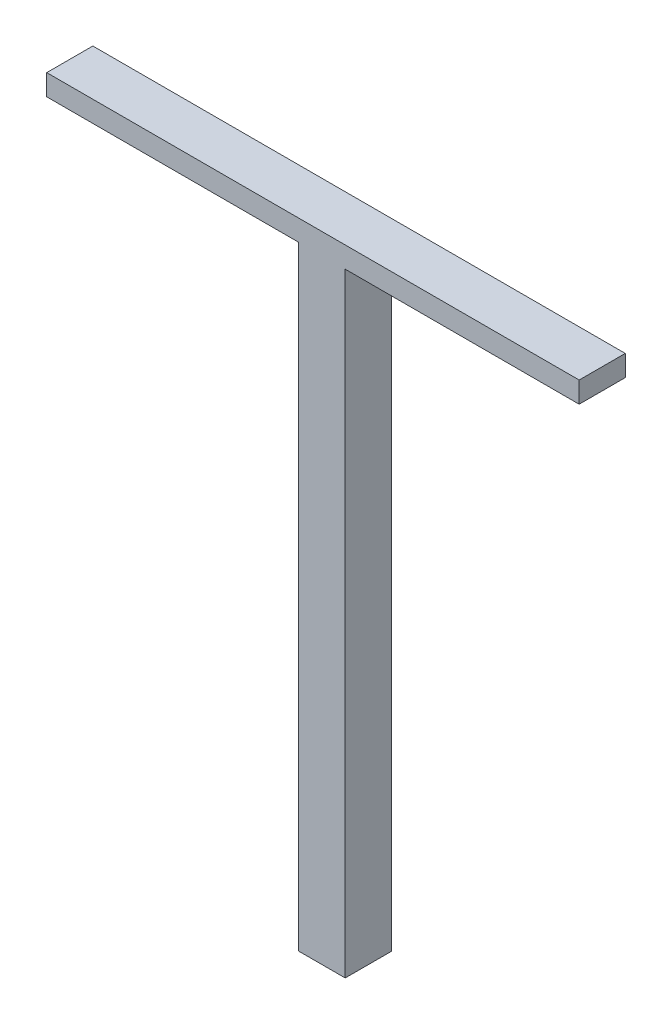
ISO-10303-21;
HEADER;
FILE_DESCRIPTION(('STEP AP214'),'2;1');
FILE_NAME('part.step','',(''),(''),'','','');
FILE_SCHEMA(('AUTOMOTIVE_DESIGN { 1 0 10303 214 1 1 1 1 }'));
ENDSEC;
DATA;
#1=APPLICATION_CONTEXT('core data for automotive mechanical design processes');
#2=APPLICATION_PROTOCOL_DEFINITION('international standard','automotive_design',2000,#1);
#3=PRODUCT_CONTEXT('',#1,'mechanical');
#4=PRODUCT('Part','Part','',(#3));
#5=PRODUCT_RELATED_PRODUCT_CATEGORY('part','',(#4));
#6=PRODUCT_DEFINITION_FORMATION('','',#4);
#7=PRODUCT_DEFINITION_CONTEXT('part definition',#1,'design');
#8=PRODUCT_DEFINITION('design','',#6,#7);
#9=PRODUCT_DEFINITION_SHAPE('','',#8);
#10=(LENGTH_UNIT() NAMED_UNIT(*) SI_UNIT(.MILLI.,.METRE.));
#11=(NAMED_UNIT(*) PLANE_ANGLE_UNIT() SI_UNIT($,.RADIAN.));
#12=(NAMED_UNIT(*) SI_UNIT($,.STERADIAN.) SOLID_ANGLE_UNIT());
#13=UNCERTAINTY_MEASURE_WITH_UNIT(LENGTH_MEASURE(1.E-05),#10,'distance_accuracy_value','');
#14=(GEOMETRIC_REPRESENTATION_CONTEXT(3) GLOBAL_UNCERTAINTY_ASSIGNED_CONTEXT((#13)) GLOBAL_UNIT_ASSIGNED_CONTEXT((#10,
#11,#12)) REPRESENTATION_CONTEXT('',''));
#15=CARTESIAN_POINT('',(0.,0.,0.));
#16=DIRECTION('',(0.,0.,1.));
#17=DIRECTION('',(1.,0.,0.));
#18=AXIS2_PLACEMENT_3D('',#15,#16,#17);
#19=CARTESIAN_POINT('',(-73.8951342761799,24.7184083303375,40.));
#20=DIRECTION('',(1.,0.,0.));
#21=DIRECTION('',(0.,0.,-1.));
#22=AXIS2_PLACEMENT_3D('',#19,#20,#21);
#23=PLANE('',#22);
#24=DIRECTION('',(0.,-1.,0.));
#25=VECTOR('',#24,1.);
#26=CARTESIAN_POINT('',(-73.8951342761799,24.7184083303375,0.));
#27=LINE('',#26,#25);
#28=CARTESIAN_POINT('',(-73.8951342761799,42.9213017638646,0.));
#29=VERTEX_POINT('',#28);
#30=CARTESIAN_POINT('',(-73.8951342761799,24.7184083303375,0.));
#31=VERTEX_POINT('',#30);
#32=EDGE_CURVE('E131',#29,#31,#27,.T.);
#33=ORIENTED_EDGE('',*,*,#32,.T.);
#34=DIRECTION('',(0.,0.,-1.));
#35=VECTOR('',#34,1.);
#36=CARTESIAN_POINT('',(-73.8951342761799,24.7184083303375,40.));
#37=LINE('',#36,#35);
#38=CARTESIAN_POINT('',(-73.8951342761799,24.7184083303375,40.));
#39=VERTEX_POINT('',#38);
#40=EDGE_CURVE('E11',#39,#31,#37,.T.);
#41=ORIENTED_EDGE('',*,*,#40,.F.);
#42=DIRECTION('',(0.,-1.,0.));
#43=VECTOR('',#42,1.);
#44=CARTESIAN_POINT('',(-73.8951342761799,24.7184083303375,40.));
#45=LINE('',#44,#43);
#46=CARTESIAN_POINT('',(-73.8951342761799,42.9213017638646,40.));
#47=VERTEX_POINT('',#46);
#48=EDGE_CURVE('E145',#47,#39,#45,.T.);
#49=ORIENTED_EDGE('',*,*,#48,.F.);
#50=DIRECTION('',(0.,0.,-1.));
#51=VECTOR('',#50,1.);
#52=CARTESIAN_POINT('',(-73.8951342761799,42.9213017638646,40.));
#53=LINE('',#52,#51);
#54=EDGE_CURVE('E127',#47,#29,#53,.T.);
#55=ORIENTED_EDGE('',*,*,#54,.T.);
#56=EDGE_LOOP('',(#33,#41,#49,#55));
#57=FACE_BOUND('',#56,.T.);
#58=ADVANCED_FACE('F35',(#57),#23,.F.);
#59=CARTESIAN_POINT('',(144.415139044337,24.7184083303375,40.));
#60=DIRECTION('',(0.,1.,0.));
#61=DIRECTION('',(0.,0.,1.));
#62=AXIS2_PLACEMENT_3D('',#59,#60,#61);
#63=PLANE('',#62);
#64=DIRECTION('',(1.,0.,0.));
#65=VECTOR('',#64,1.);
#66=CARTESIAN_POINT('',(144.415139044337,24.7184083303375,0.));
#67=LINE('',#66,#65);
#68=CARTESIAN_POINT('',(144.415139044337,24.7184083303375,0.));
#69=VERTEX_POINT('',#68);
#70=EDGE_CURVE('E134',#31,#69,#67,.T.);
#71=ORIENTED_EDGE('',*,*,#70,.T.);
#72=DIRECTION('',(0.,0.,-1.));
#73=VECTOR('',#72,1.);
#74=CARTESIAN_POINT('',(144.415139044337,24.7184083303375,40.));
#75=LINE('',#74,#73);
#76=CARTESIAN_POINT('',(144.415139044337,24.7184083303375,40.));
#77=VERTEX_POINT('',#76);
#78=EDGE_CURVE('E43',#77,#69,#75,.T.);
#79=ORIENTED_EDGE('',*,*,#78,.F.);
#80=DIRECTION('',(1.,0.,0.));
#81=VECTOR('',#80,1.);
#82=CARTESIAN_POINT('',(144.415139044337,24.7184083303375,40.));
#83=LINE('',#82,#81);
#84=EDGE_CURVE('E94',#39,#77,#83,.T.);
#85=ORIENTED_EDGE('',*,*,#84,.F.);
#86=ORIENTED_EDGE('',*,*,#40,.T.);
#87=EDGE_LOOP('',(#71,#79,#85,#86));
#88=FACE_BOUND('',#87,.T.);
#89=ADVANCED_FACE('F180',(#88),#63,.F.);
#90=CARTESIAN_POINT('',(144.415139044337,-508.025026423615,40.));
#91=DIRECTION('',(1.,0.,0.));
#92=DIRECTION('',(0.,0.,-1.));
#93=AXIS2_PLACEMENT_3D('',#90,#91,#92);
#94=PLANE('',#93);
#95=DIRECTION('',(0.,-1.,0.));
#96=VECTOR('',#95,1.);
#97=CARTESIAN_POINT('',(144.415139044337,-508.025026423615,0.));
#98=LINE('',#97,#96);
#99=CARTESIAN_POINT('',(144.415139044337,-508.025026423615,0.));
#100=VERTEX_POINT('',#99);
#101=EDGE_CURVE('E136',#69,#100,#98,.T.);
#102=ORIENTED_EDGE('',*,*,#101,.T.);
#103=DIRECTION('',(0.,0.,-1.));
#104=VECTOR('',#103,1.);
#105=CARTESIAN_POINT('',(144.415139044337,-508.025026423615,40.));
#106=LINE('',#105,#104);
#107=CARTESIAN_POINT('',(144.415139044337,-508.025026423615,40.));
#108=VERTEX_POINT('',#107);
#109=EDGE_CURVE('E152',#108,#100,#106,.T.);
#110=ORIENTED_EDGE('',*,*,#109,.F.);
#111=DIRECTION('',(0.,-1.,0.));
#112=VECTOR('',#111,1.);
#113=CARTESIAN_POINT('',(144.415139044337,-508.025026423615,40.));
#114=LINE('',#113,#112);
#115=EDGE_CURVE('E160',#77,#108,#114,.T.);
#116=ORIENTED_EDGE('',*,*,#115,.F.);
#117=ORIENTED_EDGE('',*,*,#78,.T.);
#118=EDGE_LOOP('',(#102,#110,#116,#117));
#119=FACE_BOUND('',#118,.T.);
#120=ADVANCED_FACE('F158',(#119),#94,.F.);
#121=CARTESIAN_POINT('',(185.133360284517,-508.025026423615,40.));
#122=DIRECTION('',(0.,1.,0.));
#123=DIRECTION('',(0.,0.,1.));
#124=AXIS2_PLACEMENT_3D('',#121,#122,#123);
#125=PLANE('',#124);
#126=DIRECTION('',(1.,0.,0.));
#127=VECTOR('',#126,1.);
#128=CARTESIAN_POINT('',(185.133360284517,-508.025026423615,0.));
#129=LINE('',#128,#127);
#130=CARTESIAN_POINT('',(185.133360284517,-508.025026423615,0.));
#131=VERTEX_POINT('',#130);
#132=EDGE_CURVE('E138',#100,#131,#129,.T.);
#133=ORIENTED_EDGE('',*,*,#132,.T.);
#134=DIRECTION('',(0.,0.,-1.));
#135=VECTOR('',#134,1.);
#136=CARTESIAN_POINT('',(185.133360284517,-508.025026423615,40.));
#137=LINE('',#136,#135);
#138=CARTESIAN_POINT('',(185.133360284517,-508.025026423615,40.));
#139=VERTEX_POINT('',#138);
#140=EDGE_CURVE('E149',#139,#131,#137,.T.);
#141=ORIENTED_EDGE('',*,*,#140,.F.);
#142=DIRECTION('',(1.,0.,0.));
#143=VECTOR('',#142,1.);
#144=CARTESIAN_POINT('',(185.133360284517,-508.025026423615,40.));
#145=LINE('',#144,#143);
#146=EDGE_CURVE('E172',#108,#139,#145,.T.);
#147=ORIENTED_EDGE('',*,*,#146,.F.);
#148=ORIENTED_EDGE('',*,*,#109,.T.);
#149=EDGE_LOOP('',(#133,#141,#147,#148));
#150=FACE_BOUND('',#149,.T.);
#151=ADVANCED_FACE('F168',(#150),#125,.F.);
#152=CARTESIAN_POINT('',(185.133360284517,24.7184083303375,40.));
#153=DIRECTION('',(-1.,0.,0.));
#154=DIRECTION('',(0.,0.,1.));
#155=AXIS2_PLACEMENT_3D('',#152,#153,#154);
#156=PLANE('',#155);
#157=DIRECTION('',(0.,1.,0.));
#158=VECTOR('',#157,1.);
#159=CARTESIAN_POINT('',(185.133360284517,24.7184083303375,0.));
#160=LINE('',#159,#158);
#161=CARTESIAN_POINT('',(185.133360284517,24.7184083303375,0.));
#162=VERTEX_POINT('',#161);
#163=EDGE_CURVE('E140',#131,#162,#160,.T.);
#164=ORIENTED_EDGE('',*,*,#163,.T.);
#165=DIRECTION('',(0.,0.,-1.));
#166=VECTOR('',#165,1.);
#167=CARTESIAN_POINT('',(185.133360284517,24.7184083303375,40.));
#168=LINE('',#167,#166);
#169=CARTESIAN_POINT('',(185.133360284517,24.7184083303375,40.));
#170=VERTEX_POINT('',#169);
#171=EDGE_CURVE('E122',#170,#162,#168,.T.);
#172=ORIENTED_EDGE('',*,*,#171,.F.);
#173=DIRECTION('',(0.,1.,0.));
#174=VECTOR('',#173,1.);
#175=CARTESIAN_POINT('',(185.133360284517,24.7184083303375,40.));
#176=LINE('',#175,#174);
#177=EDGE_CURVE('E113',#139,#170,#176,.T.);
#178=ORIENTED_EDGE('',*,*,#177,.F.);
#179=ORIENTED_EDGE('',*,*,#140,.T.);
#180=EDGE_LOOP('',(#164,#172,#178,#179));
#181=FACE_BOUND('',#180,.T.);
#182=ADVANCED_FACE('F171',(#181),#156,.F.);
#183=CARTESIAN_POINT('',(388.168111391347,24.7184083303375,40.));
#184=DIRECTION('',(0.,1.,0.));
#185=DIRECTION('',(0.,0.,1.));
#186=AXIS2_PLACEMENT_3D('',#183,#184,#185);
#187=PLANE('',#186);
#188=DIRECTION('',(1.,0.,0.));
#189=VECTOR('',#188,1.);
#190=CARTESIAN_POINT('',(388.168111391347,24.7184083303375,0.));
#191=LINE('',#190,#189);
#192=CARTESIAN_POINT('',(388.168111391347,24.7184083303375,0.));
#193=VERTEX_POINT('',#192);
#194=EDGE_CURVE('E121',#162,#193,#191,.T.);
#195=ORIENTED_EDGE('',*,*,#194,.T.);
#196=DIRECTION('',(0.,0.,-1.));
#197=VECTOR('',#196,1.);
#198=CARTESIAN_POINT('',(388.168111391347,24.7184083303375,40.));
#199=LINE('',#198,#197);
#200=CARTESIAN_POINT('',(388.168111391347,24.7184083303375,40.));
#201=VERTEX_POINT('',#200);
#202=EDGE_CURVE('E118',#201,#193,#199,.T.);
#203=ORIENTED_EDGE('',*,*,#202,.F.);
#204=DIRECTION('',(1.,0.,0.));
#205=VECTOR('',#204,1.);
#206=CARTESIAN_POINT('',(388.168111391347,24.7184083303375,40.));
#207=LINE('',#206,#205);
#208=EDGE_CURVE('E107',#170,#201,#207,.T.);
#209=ORIENTED_EDGE('',*,*,#208,.F.);
#210=ORIENTED_EDGE('',*,*,#171,.T.);
#211=EDGE_LOOP('',(#195,#203,#209,#210));
#212=FACE_BOUND('',#211,.T.);
#213=ADVANCED_FACE('F119',(#212),#187,.F.);
#214=CARTESIAN_POINT('',(388.168111391347,42.9213017638646,40.));
#215=DIRECTION('',(-1.,0.,0.));
#216=DIRECTION('',(0.,0.,1.));
#217=AXIS2_PLACEMENT_3D('',#214,#215,#216);
#218=PLANE('',#217);
#219=DIRECTION('',(0.,1.,0.));
#220=VECTOR('',#219,1.);
#221=CARTESIAN_POINT('',(388.168111391347,42.9213017638646,0.));
#222=LINE('',#221,#220);
#223=CARTESIAN_POINT('',(388.168111391347,42.9213017638646,0.));
#224=VERTEX_POINT('',#223);
#225=EDGE_CURVE('E80',#193,#224,#222,.T.);
#226=ORIENTED_EDGE('',*,*,#225,.T.);
#227=DIRECTION('',(0.,0.,-1.));
#228=VECTOR('',#227,1.);
#229=CARTESIAN_POINT('',(388.168111391347,42.9213017638646,40.));
#230=LINE('',#229,#228);
#231=CARTESIAN_POINT('',(388.168111391347,42.9213017638646,40.));
#232=VERTEX_POINT('',#231);
#233=EDGE_CURVE('E123',#232,#224,#230,.T.);
#234=ORIENTED_EDGE('',*,*,#233,.F.);
#235=DIRECTION('',(0.,1.,0.));
#236=VECTOR('',#235,1.);
#237=CARTESIAN_POINT('',(388.168111391347,42.9213017638646,40.));
#238=LINE('',#237,#236);
#239=EDGE_CURVE('E111',#201,#232,#238,.T.);
#240=ORIENTED_EDGE('',*,*,#239,.F.);
#241=ORIENTED_EDGE('',*,*,#202,.T.);
#242=EDGE_LOOP('',(#226,#234,#240,#241));
#243=FACE_BOUND('',#242,.T.);
#244=ADVANCED_FACE('F125',(#243),#218,.F.);
#245=CARTESIAN_POINT('',(-73.8951342761799,42.9213017638646,40.));
#246=DIRECTION('',(0.,-1.,0.));
#247=DIRECTION('',(0.,0.,-1.));
#248=AXIS2_PLACEMENT_3D('',#245,#246,#247);
#249=PLANE('',#248);
#250=DIRECTION('',(-1.,0.,0.));
#251=VECTOR('',#250,1.);
#252=CARTESIAN_POINT('',(-73.8951342761799,42.9213017638646,0.));
#253=LINE('',#252,#251);
#254=EDGE_CURVE('E86',#224,#29,#253,.T.);
#255=ORIENTED_EDGE('',*,*,#254,.T.);
#256=ORIENTED_EDGE('',*,*,#54,.F.);
#257=DIRECTION('',(-1.,0.,0.));
#258=VECTOR('',#257,1.);
#259=CARTESIAN_POINT('',(-73.8951342761799,42.9213017638646,40.));
#260=LINE('',#259,#258);
#261=EDGE_CURVE('E51',#232,#47,#260,.T.);
#262=ORIENTED_EDGE('',*,*,#261,.F.);
#263=ORIENTED_EDGE('',*,*,#233,.T.);
#264=EDGE_LOOP('',(#255,#256,#262,#263));
#265=FACE_BOUND('',#264,.T.);
#266=ADVANCED_FACE('F196',(#265),#249,.F.);
#267=CARTESIAN_POINT('',(0.,0.,40.));
#268=DIRECTION('',(0.,0.,-1.));
#269=DIRECTION('',(-1.,0.,0.));
#270=AXIS2_PLACEMENT_3D('',#267,#268,#269);
#271=PLANE('',#270);
#272=ORIENTED_EDGE('',*,*,#48,.T.);
#273=ORIENTED_EDGE('',*,*,#84,.T.);
#274=ORIENTED_EDGE('',*,*,#115,.T.);
#275=ORIENTED_EDGE('',*,*,#146,.T.);
#276=ORIENTED_EDGE('',*,*,#177,.T.);
#277=ORIENTED_EDGE('',*,*,#208,.T.);
#278=ORIENTED_EDGE('',*,*,#239,.T.);
#279=ORIENTED_EDGE('',*,*,#261,.T.);
#280=EDGE_LOOP('',(#272,#273,#274,#275,#276,#277,#278,#279));
#281=FACE_BOUND('',#280,.T.);
#282=ADVANCED_FACE('F109',(#281),#271,.F.);
#283=CARTESIAN_POINT('',(0.,0.,0.));
#284=DIRECTION('',(0.,0.,-1.));
#285=DIRECTION('',(-1.,0.,0.));
#286=AXIS2_PLACEMENT_3D('',#283,#284,#285);
#287=PLANE('',#286);
#288=ORIENTED_EDGE('',*,*,#32,.F.);
#289=ORIENTED_EDGE('',*,*,#254,.F.);
#290=ORIENTED_EDGE('',*,*,#225,.F.);
#291=ORIENTED_EDGE('',*,*,#194,.F.);
#292=ORIENTED_EDGE('',*,*,#163,.F.);
#293=ORIENTED_EDGE('',*,*,#132,.F.);
#294=ORIENTED_EDGE('',*,*,#101,.F.);
#295=ORIENTED_EDGE('',*,*,#70,.F.);
#296=EDGE_LOOP('',(#288,#289,#290,#291,#292,#293,#294,#295));
#297=FACE_BOUND('',#296,.T.);
#298=ADVANCED_FACE('F164',(#297),#287,.T.);
#299=CLOSED_SHELL('',(#58,#89,#120,#151,#182,#213,#244,#266,#282,#298));
#300=MANIFOLD_SOLID_BREP('B2',#299);
#301=ADVANCED_BREP_SHAPE_REPRESENTATION('',(#18,#300),#14);
#302=SHAPE_DEFINITION_REPRESENTATION(#9,#301);
ENDSEC;
END-ISO-10303-21;
